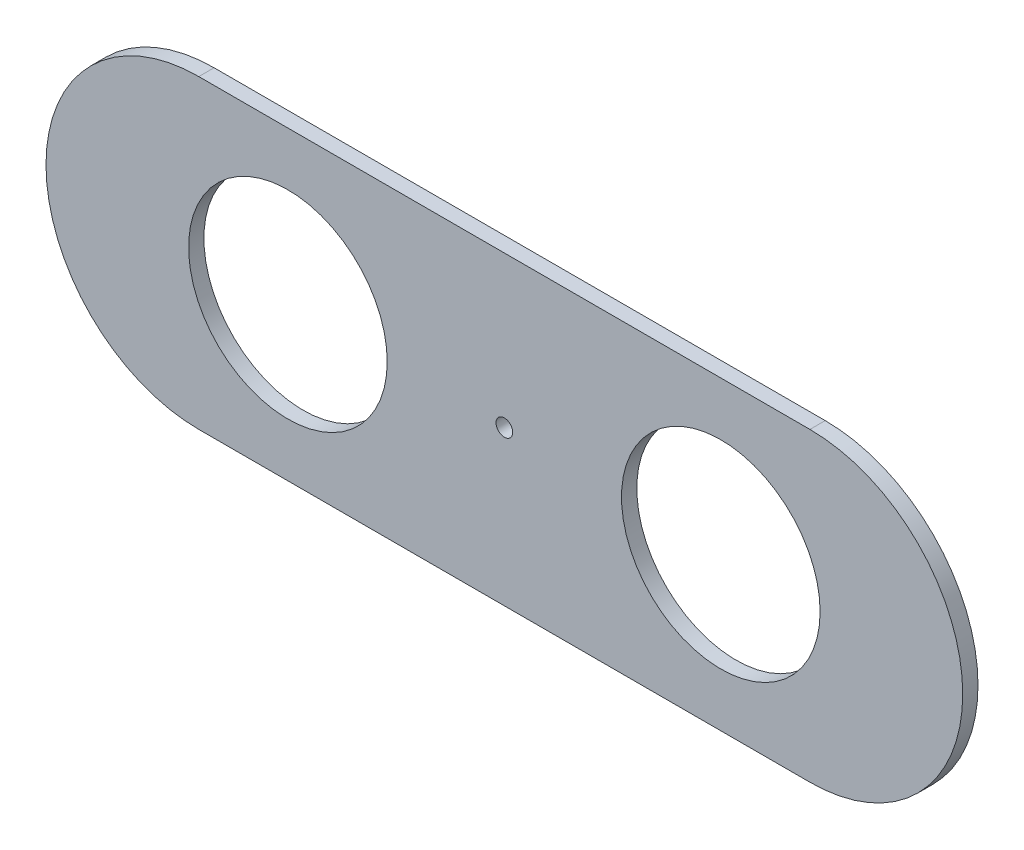
ISO-10303-21;
HEADER;
FILE_DESCRIPTION(('STEP AP214'),'2;1');
FILE_NAME('part.step','',(''),(''),'','','');
FILE_SCHEMA(('AUTOMOTIVE_DESIGN { 1 0 10303 214 1 1 1 1 }'));
ENDSEC;
DATA;
#1=APPLICATION_CONTEXT('core data for automotive mechanical design processes');
#2=APPLICATION_PROTOCOL_DEFINITION('international standard','automotive_design',2000,#1);
#3=PRODUCT_CONTEXT('',#1,'mechanical');
#4=PRODUCT('Part','Part','',(#3));
#5=PRODUCT_RELATED_PRODUCT_CATEGORY('part','',(#4));
#6=PRODUCT_DEFINITION_FORMATION('','',#4);
#7=PRODUCT_DEFINITION_CONTEXT('part definition',#1,'design');
#8=PRODUCT_DEFINITION('design','',#6,#7);
#9=PRODUCT_DEFINITION_SHAPE('','',#8);
#10=(LENGTH_UNIT() NAMED_UNIT(*) SI_UNIT(.MILLI.,.METRE.));
#11=(NAMED_UNIT(*) PLANE_ANGLE_UNIT() SI_UNIT($,.RADIAN.));
#12=(NAMED_UNIT(*) SI_UNIT($,.STERADIAN.) SOLID_ANGLE_UNIT());
#13=UNCERTAINTY_MEASURE_WITH_UNIT(LENGTH_MEASURE(1.E-05),#10,'distance_accuracy_value','');
#14=(GEOMETRIC_REPRESENTATION_CONTEXT(3) GLOBAL_UNCERTAINTY_ASSIGNED_CONTEXT((#13)) GLOBAL_UNIT_ASSIGNED_CONTEXT((#10,
#11,#12)) REPRESENTATION_CONTEXT('',''));
#15=CARTESIAN_POINT('',(0.,0.,0.));
#16=DIRECTION('',(0.,0.,1.));
#17=DIRECTION('',(1.,0.,0.));
#18=AXIS2_PLACEMENT_3D('',#15,#16,#17);
#19=CARTESIAN_POINT('',(120.,0.,6.));
#20=DIRECTION('',(0.,0.,-1.));
#21=DIRECTION('',(-1.,0.,0.));
#22=AXIS2_PLACEMENT_3D('',#19,#20,#21);
#23=CYLINDRICAL_SURFACE('',#22,60.);
#24=CARTESIAN_POINT('',(120.,0.,0.));
#25=DIRECTION('',(0.,0.,1.));
#26=DIRECTION('',(1.,0.,0.));
#27=AXIS2_PLACEMENT_3D('',#24,#25,#26);
#28=CIRCLE('',#27,60.);
#29=CARTESIAN_POINT('',(120.,-60.,0.));
#30=VERTEX_POINT('',#29);
#31=CARTESIAN_POINT('',(120.,60.,0.));
#32=VERTEX_POINT('',#31);
#33=EDGE_CURVE('E102',#30,#32,#28,.T.);
#34=ORIENTED_EDGE('',*,*,#33,.T.);
#35=DIRECTION('',(0.,0.,-1.));
#36=VECTOR('',#35,1.);
#37=CARTESIAN_POINT('',(120.,60.,6.));
#38=LINE('',#37,#36);
#39=CARTESIAN_POINT('',(120.,60.,6.));
#40=VERTEX_POINT('',#39);
#41=EDGE_CURVE('E11',#40,#32,#38,.T.);
#42=ORIENTED_EDGE('',*,*,#41,.F.);
#43=CARTESIAN_POINT('',(120.,0.,6.));
#44=DIRECTION('',(0.,0.,1.));
#45=DIRECTION('',(1.,0.,0.));
#46=AXIS2_PLACEMENT_3D('',#43,#44,#45);
#47=CIRCLE('',#46,60.);
#48=CARTESIAN_POINT('',(120.,-60.,6.));
#49=VERTEX_POINT('',#48);
#50=EDGE_CURVE('E90',#49,#40,#47,.T.);
#51=ORIENTED_EDGE('',*,*,#50,.F.);
#52=DIRECTION('',(0.,0.,-1.));
#53=VECTOR('',#52,1.);
#54=CARTESIAN_POINT('',(120.,-60.,6.));
#55=LINE('',#54,#53);
#56=EDGE_CURVE('E98',#49,#30,#55,.T.);
#57=ORIENTED_EDGE('',*,*,#56,.T.);
#58=EDGE_LOOP('',(#34,#42,#51,#57));
#59=FACE_BOUND('',#58,.T.);
#60=ADVANCED_FACE('F39',(#59),#23,.T.);
#61=CARTESIAN_POINT('',(120.,60.,6.));
#62=DIRECTION('',(0.,-1.,0.));
#63=DIRECTION('',(1.,0.,0.));
#64=AXIS2_PLACEMENT_3D('',#61,#62,#63);
#65=PLANE('',#64);
#66=DIRECTION('',(-1.,0.,0.));
#67=VECTOR('',#66,1.);
#68=CARTESIAN_POINT('',(120.,60.,0.));
#69=LINE('',#68,#67);
#70=CARTESIAN_POINT('',(-120.,60.,0.));
#71=VERTEX_POINT('',#70);
#72=EDGE_CURVE('E94',#32,#71,#69,.T.);
#73=ORIENTED_EDGE('',*,*,#72,.T.);
#74=DIRECTION('',(0.,0.,-1.));
#75=VECTOR('',#74,1.);
#76=CARTESIAN_POINT('',(-120.,60.,6.));
#77=LINE('',#76,#75);
#78=CARTESIAN_POINT('',(-120.,60.,6.));
#79=VERTEX_POINT('',#78);
#80=EDGE_CURVE('E47',#79,#71,#77,.T.);
#81=ORIENTED_EDGE('',*,*,#80,.F.);
#82=DIRECTION('',(-1.,0.,0.));
#83=VECTOR('',#82,1.);
#84=CARTESIAN_POINT('',(120.,60.,6.));
#85=LINE('',#84,#83);
#86=EDGE_CURVE('E85',#40,#79,#85,.T.);
#87=ORIENTED_EDGE('',*,*,#86,.F.);
#88=ORIENTED_EDGE('',*,*,#41,.T.);
#89=EDGE_LOOP('',(#73,#81,#87,#88));
#90=FACE_BOUND('',#89,.T.);
#91=ADVANCED_FACE('F93',(#90),#65,.F.);
#92=CARTESIAN_POINT('',(-120.,0.,6.));
#93=DIRECTION('',(0.,0.,-1.));
#94=DIRECTION('',(-1.,0.,0.));
#95=AXIS2_PLACEMENT_3D('',#92,#93,#94);
#96=CYLINDRICAL_SURFACE('',#95,60.);
#97=CARTESIAN_POINT('',(-120.,0.,0.));
#98=DIRECTION('',(0.,0.,1.));
#99=DIRECTION('',(1.,0.,0.));
#100=AXIS2_PLACEMENT_3D('',#97,#98,#99);
#101=CIRCLE('',#100,60.);
#102=CARTESIAN_POINT('',(-120.,-60.,0.));
#103=VERTEX_POINT('',#102);
#104=EDGE_CURVE('E72',#71,#103,#101,.T.);
#105=ORIENTED_EDGE('',*,*,#104,.T.);
#106=DIRECTION('',(0.,0.,-1.));
#107=VECTOR('',#106,1.);
#108=CARTESIAN_POINT('',(-120.,-60.,6.));
#109=LINE('',#108,#107);
#110=CARTESIAN_POINT('',(-120.,-60.,6.));
#111=VERTEX_POINT('',#110);
#112=EDGE_CURVE('E95',#111,#103,#109,.T.);
#113=ORIENTED_EDGE('',*,*,#112,.F.);
#114=CARTESIAN_POINT('',(-120.,0.,6.));
#115=DIRECTION('',(0.,0.,1.));
#116=DIRECTION('',(1.,0.,0.));
#117=AXIS2_PLACEMENT_3D('',#114,#115,#116);
#118=CIRCLE('',#117,60.);
#119=EDGE_CURVE('E88',#79,#111,#118,.T.);
#120=ORIENTED_EDGE('',*,*,#119,.F.);
#121=ORIENTED_EDGE('',*,*,#80,.T.);
#122=EDGE_LOOP('',(#105,#113,#120,#121));
#123=FACE_BOUND('',#122,.T.);
#124=ADVANCED_FACE('F96',(#123),#96,.T.);
#125=CARTESIAN_POINT('',(120.,-60.,6.));
#126=DIRECTION('',(0.,1.,0.));
#127=DIRECTION('',(-1.,0.,0.));
#128=AXIS2_PLACEMENT_3D('',#125,#126,#127);
#129=PLANE('',#128);
#130=DIRECTION('',(1.,0.,0.));
#131=VECTOR('',#130,1.);
#132=CARTESIAN_POINT('',(120.,-60.,0.));
#133=LINE('',#132,#131);
#134=EDGE_CURVE('E78',#103,#30,#133,.T.);
#135=ORIENTED_EDGE('',*,*,#134,.T.);
#136=ORIENTED_EDGE('',*,*,#56,.F.);
#137=DIRECTION('',(1.,0.,0.));
#138=VECTOR('',#137,1.);
#139=CARTESIAN_POINT('',(120.,-60.,6.));
#140=LINE('',#139,#138);
#141=EDGE_CURVE('E55',#111,#49,#140,.T.);
#142=ORIENTED_EDGE('',*,*,#141,.F.);
#143=ORIENTED_EDGE('',*,*,#112,.T.);
#144=EDGE_LOOP('',(#135,#136,#142,#143));
#145=FACE_BOUND('',#144,.T.);
#146=ADVANCED_FACE('F110',(#145),#129,.F.);
#147=CARTESIAN_POINT('',(120.,0.,6.));
#148=DIRECTION('',(0.,0.,1.));
#149=DIRECTION('',(1.,0.,0.));
#150=AXIS2_PLACEMENT_3D('',#147,#148,#149);
#151=PLANE('',#150);
#152=CARTESIAN_POINT('',(-85.,0.,6.));
#153=DIRECTION('',(0.,0.,1.));
#154=DIRECTION('',(1.,0.,0.));
#155=AXIS2_PLACEMENT_3D('',#152,#153,#154);
#156=CIRCLE('',#155,39.);
#157=CARTESIAN_POINT('',(-46.,0.,6.));
#158=VERTEX_POINT('',#157);
#159=EDGE_CURVE('E125',#158,#158,#156,.T.);
#160=ORIENTED_EDGE('',*,*,#159,.F.);
#161=EDGE_LOOP('',(#160));
#162=FACE_BOUND('',#161,.T.);
#163=CARTESIAN_POINT('',(85.,0.,6.));
#164=DIRECTION('',(0.,0.,1.));
#165=DIRECTION('',(1.,0.,0.));
#166=AXIS2_PLACEMENT_3D('',#163,#164,#165);
#167=CIRCLE('',#166,39.);
#168=CARTESIAN_POINT('',(124.,0.,6.));
#169=VERTEX_POINT('',#168);
#170=EDGE_CURVE('E122',#169,#169,#167,.T.);
#171=ORIENTED_EDGE('',*,*,#170,.F.);
#172=EDGE_LOOP('',(#171));
#173=FACE_BOUND('',#172,.T.);
#174=CARTESIAN_POINT('',(0.,0.625000000000046,6.));
#175=DIRECTION('',(0.,0.,1.));
#176=DIRECTION('',(1.,0.,0.));
#177=AXIS2_PLACEMENT_3D('',#174,#175,#176);
#178=CIRCLE('',#177,3.275);
#179=CARTESIAN_POINT('',(3.275,0.625000000000046,6.));
#180=VERTEX_POINT('',#179);
#181=EDGE_CURVE('E118',#180,#180,#178,.T.);
#182=ORIENTED_EDGE('',*,*,#181,.F.);
#183=EDGE_LOOP('',(#182));
#184=FACE_BOUND('',#183,.T.);
#185=ORIENTED_EDGE('',*,*,#50,.T.);
#186=ORIENTED_EDGE('',*,*,#86,.T.);
#187=ORIENTED_EDGE('',*,*,#119,.T.);
#188=ORIENTED_EDGE('',*,*,#141,.T.);
#189=EDGE_LOOP('',(#185,#186,#187,#188));
#190=FACE_BOUND('',#189,.T.);
#191=ADVANCED_FACE('F86',(#162,#173,#184,#190),#151,.T.);
#192=CARTESIAN_POINT('',(120.,0.,0.));
#193=DIRECTION('',(0.,0.,1.));
#194=DIRECTION('',(1.,0.,0.));
#195=AXIS2_PLACEMENT_3D('',#192,#193,#194);
#196=PLANE('',#195);
#197=CARTESIAN_POINT('',(-85.,0.,0.));
#198=DIRECTION('',(0.,0.,1.));
#199=DIRECTION('',(1.,0.,0.));
#200=AXIS2_PLACEMENT_3D('',#197,#198,#199);
#201=CIRCLE('',#200,39.);
#202=CARTESIAN_POINT('',(-46.,0.,0.));
#203=VERTEX_POINT('',#202);
#204=EDGE_CURVE('E121',#203,#203,#201,.F.);
#205=ORIENTED_EDGE('',*,*,#204,.F.);
#206=EDGE_LOOP('',(#205));
#207=FACE_BOUND('',#206,.T.);
#208=CARTESIAN_POINT('',(85.,0.,0.));
#209=DIRECTION('',(0.,0.,1.));
#210=DIRECTION('',(1.,0.,0.));
#211=AXIS2_PLACEMENT_3D('',#208,#209,#210);
#212=CIRCLE('',#211,39.);
#213=CARTESIAN_POINT('',(124.,0.,0.));
#214=VERTEX_POINT('',#213);
#215=EDGE_CURVE('E126',#214,#214,#212,.F.);
#216=ORIENTED_EDGE('',*,*,#215,.F.);
#217=EDGE_LOOP('',(#216));
#218=FACE_BOUND('',#217,.T.);
#219=CARTESIAN_POINT('',(0.,0.625000000000046,0.));
#220=DIRECTION('',(0.,0.,1.));
#221=DIRECTION('',(1.,0.,0.));
#222=AXIS2_PLACEMENT_3D('',#219,#220,#221);
#223=CIRCLE('',#222,3.275);
#224=CARTESIAN_POINT('',(3.275,0.625000000000046,0.));
#225=VERTEX_POINT('',#224);
#226=EDGE_CURVE('E105',#225,#225,#223,.F.);
#227=ORIENTED_EDGE('',*,*,#226,.F.);
#228=EDGE_LOOP('',(#227));
#229=FACE_BOUND('',#228,.T.);
#230=ORIENTED_EDGE('',*,*,#33,.F.);
#231=ORIENTED_EDGE('',*,*,#134,.F.);
#232=ORIENTED_EDGE('',*,*,#104,.F.);
#233=ORIENTED_EDGE('',*,*,#72,.F.);
#234=EDGE_LOOP('',(#230,#231,#232,#233));
#235=FACE_BOUND('',#234,.T.);
#236=ADVANCED_FACE('F113',(#207,#218,#229,#235),#196,.F.);
#237=CARTESIAN_POINT('',(0.,0.625000000000046,-0.00100000000000013));
#238=DIRECTION('',(0.,0.,1.));
#239=DIRECTION('',(1.,0.,0.));
#240=AXIS2_PLACEMENT_3D('',#237,#238,#239);
#241=CYLINDRICAL_SURFACE('',#240,3.275);
#242=CARTESIAN_POINT('',(3.275,0.625000000000046,6.));
#243=CARTESIAN_POINT('',(3.275,0.625000000000046,5.9375));
#244=CARTESIAN_POINT('',(3.275,0.625000000000046,5.875));
#245=CARTESIAN_POINT('',(3.275,0.625000000000046,5.75));
#246=CARTESIAN_POINT('',(3.275,0.625000000000046,5.6875));
#247=CARTESIAN_POINT('',(3.275,0.625000000000046,5.5625));
#248=CARTESIAN_POINT('',(3.275,0.625000000000046,5.5));
#249=CARTESIAN_POINT('',(3.275,0.625000000000046,5.375));
#250=CARTESIAN_POINT('',(3.275,0.625000000000046,5.3125));
#251=CARTESIAN_POINT('',(3.275,0.625000000000046,5.1875));
#252=CARTESIAN_POINT('',(3.275,0.625000000000046,5.125));
#253=CARTESIAN_POINT('',(3.275,0.625000000000046,5.));
#254=CARTESIAN_POINT('',(3.275,0.625000000000046,4.9375));
#255=CARTESIAN_POINT('',(3.275,0.625000000000046,4.8125));
#256=CARTESIAN_POINT('',(3.275,0.625000000000046,4.75));
#257=CARTESIAN_POINT('',(3.275,0.625000000000046,4.625));
#258=CARTESIAN_POINT('',(3.275,0.625000000000046,4.5625));
#259=CARTESIAN_POINT('',(3.275,0.625000000000046,4.4375));
#260=CARTESIAN_POINT('',(3.275,0.625000000000046,4.375));
#261=CARTESIAN_POINT('',(3.275,0.625000000000046,4.25));
#262=CARTESIAN_POINT('',(3.275,0.625000000000046,4.1875));
#263=CARTESIAN_POINT('',(3.275,0.625000000000046,4.0625));
#264=CARTESIAN_POINT('',(3.275,0.625000000000046,4.));
#265=CARTESIAN_POINT('',(3.275,0.625000000000046,3.875));
#266=CARTESIAN_POINT('',(3.275,0.625000000000046,3.8125));
#267=CARTESIAN_POINT('',(3.275,0.625000000000046,3.6875));
#268=CARTESIAN_POINT('',(3.275,0.625000000000046,3.625));
#269=CARTESIAN_POINT('',(3.275,0.625000000000046,3.5));
#270=CARTESIAN_POINT('',(3.275,0.625000000000046,3.4375));
#271=CARTESIAN_POINT('',(3.275,0.625000000000046,3.3125));
#272=CARTESIAN_POINT('',(3.275,0.625000000000046,3.25));
#273=CARTESIAN_POINT('',(3.275,0.625000000000046,3.125));
#274=CARTESIAN_POINT('',(3.275,0.625000000000046,3.0625));
#275=CARTESIAN_POINT('',(3.275,0.625000000000046,2.9375));
#276=CARTESIAN_POINT('',(3.275,0.625000000000046,2.875));
#277=CARTESIAN_POINT('',(3.275,0.625000000000046,2.75));
#278=CARTESIAN_POINT('',(3.275,0.625000000000046,2.6875));
#279=CARTESIAN_POINT('',(3.275,0.625000000000046,2.5625));
#280=CARTESIAN_POINT('',(3.275,0.625000000000046,2.5));
#281=CARTESIAN_POINT('',(3.275,0.625000000000046,2.375));
#282=CARTESIAN_POINT('',(3.275,0.625000000000046,2.3125));
#283=CARTESIAN_POINT('',(3.275,0.625000000000046,2.1875));
#284=CARTESIAN_POINT('',(3.275,0.625000000000046,2.125));
#285=CARTESIAN_POINT('',(3.275,0.625000000000046,2.));
#286=CARTESIAN_POINT('',(3.275,0.625000000000046,1.9375));
#287=CARTESIAN_POINT('',(3.275,0.625000000000046,1.8125));
#288=CARTESIAN_POINT('',(3.275,0.625000000000046,1.75));
#289=CARTESIAN_POINT('',(3.275,0.625000000000046,1.625));
#290=CARTESIAN_POINT('',(3.275,0.625000000000046,1.5625));
#291=CARTESIAN_POINT('',(3.275,0.625000000000046,1.4375));
#292=CARTESIAN_POINT('',(3.275,0.625000000000046,1.375));
#293=CARTESIAN_POINT('',(3.275,0.625000000000046,1.25));
#294=CARTESIAN_POINT('',(3.275,0.625000000000046,1.1875));
#295=CARTESIAN_POINT('',(3.275,0.625000000000046,1.0625));
#296=CARTESIAN_POINT('',(3.275,0.625000000000046,1.));
#297=CARTESIAN_POINT('',(3.275,0.625000000000046,0.875));
#298=CARTESIAN_POINT('',(3.275,0.625000000000046,0.8125));
#299=CARTESIAN_POINT('',(3.275,0.625000000000046,0.6875));
#300=CARTESIAN_POINT('',(3.275,0.625000000000046,0.625));
#301=CARTESIAN_POINT('',(3.275,0.625000000000046,0.5));
#302=CARTESIAN_POINT('',(3.275,0.625000000000046,0.4375));
#303=CARTESIAN_POINT('',(3.275,0.625000000000046,0.3125));
#304=CARTESIAN_POINT('',(3.275,0.625000000000046,0.25));
#305=CARTESIAN_POINT('',(3.275,0.625000000000046,0.125));
#306=CARTESIAN_POINT('',(3.275,0.625000000000046,0.0625000000000001));
#307=CARTESIAN_POINT('',(3.275,0.625000000000046,0.));
#308=B_SPLINE_CURVE_WITH_KNOTS('',3,(#242,#243,#244,#245,#246,#247,#248,#249,#250,#251,#252,
#253,#254,#255,#256,#257,#258,#259,#260,#261,#262,#263,#264,#265,#266,#267,#268,#269,#270,#271,
#272,#273,#274,#275,#276,#277,#278,#279,#280,#281,#282,#283,#284,#285,#286,#287,#288,#289,#290,
#291,#292,#293,#294,#295,#296,#297,#298,#299,#300,#301,#302,#303,#304,#305,#306,#307),
.UNSPECIFIED.,.F.,.F.,(4,2,2,2,2,2,2,2,2,2,2,2,2,2,2,2,2,2,2,2,2,2,2,2,2,2,2,2,2,2,2,2,4),(0.,
0.1875,0.375,0.5625,0.75,0.9375,1.125,1.3125,1.5,1.6875,1.875,2.0625,2.25,2.4375,2.625,2.8125,
3.,3.1875,3.375,3.5625,3.75,3.9375,4.125,4.3125,4.5,4.6875,4.875,5.0625,5.25,5.4375,5.625,
5.8125,6.),.UNSPECIFIED.);
#309=EDGE_CURVE('BSEAM144',#180,#225,#308,.T.);
#310=ORIENTED_EDGE('',*,*,#181,.T.);
#311=ORIENTED_EDGE('',*,*,#226,.T.);
#312=ORIENTED_EDGE('',*,*,#309,.T.);
#313=ORIENTED_EDGE('',*,*,#309,.F.);
#314=EDGE_LOOP('',(#310,#312,#311,#313));
#315=FACE_BOUND('',#314,.T.);
#316=ADVANCED_FACE('F144',(#315),#241,.F.);
#317=CARTESIAN_POINT('',(85.,0.,-0.00100000000000013));
#318=DIRECTION('',(0.,0.,1.));
#319=DIRECTION('',(1.,0.,0.));
#320=AXIS2_PLACEMENT_3D('',#317,#318,#319);
#321=CYLINDRICAL_SURFACE('',#320,39.);
#322=CARTESIAN_POINT('',(124.,0.,6.));
#323=CARTESIAN_POINT('',(124.,0.,5.9375));
#324=CARTESIAN_POINT('',(124.,0.,5.875));
#325=CARTESIAN_POINT('',(124.,0.,5.75));
#326=CARTESIAN_POINT('',(124.,0.,5.6875));
#327=CARTESIAN_POINT('',(124.,0.,5.5625));
#328=CARTESIAN_POINT('',(124.,0.,5.5));
#329=CARTESIAN_POINT('',(124.,0.,5.375));
#330=CARTESIAN_POINT('',(124.,0.,5.3125));
#331=CARTESIAN_POINT('',(124.,0.,5.1875));
#332=CARTESIAN_POINT('',(124.,0.,5.125));
#333=CARTESIAN_POINT('',(124.,0.,5.));
#334=CARTESIAN_POINT('',(124.,0.,4.9375));
#335=CARTESIAN_POINT('',(124.,0.,4.8125));
#336=CARTESIAN_POINT('',(124.,0.,4.75));
#337=CARTESIAN_POINT('',(124.,0.,4.625));
#338=CARTESIAN_POINT('',(124.,0.,4.5625));
#339=CARTESIAN_POINT('',(124.,0.,4.4375));
#340=CARTESIAN_POINT('',(124.,0.,4.375));
#341=CARTESIAN_POINT('',(124.,0.,4.25));
#342=CARTESIAN_POINT('',(124.,0.,4.1875));
#343=CARTESIAN_POINT('',(124.,0.,4.0625));
#344=CARTESIAN_POINT('',(124.,0.,4.));
#345=CARTESIAN_POINT('',(124.,0.,3.875));
#346=CARTESIAN_POINT('',(124.,0.,3.8125));
#347=CARTESIAN_POINT('',(124.,0.,3.6875));
#348=CARTESIAN_POINT('',(124.,0.,3.625));
#349=CARTESIAN_POINT('',(124.,0.,3.5));
#350=CARTESIAN_POINT('',(124.,0.,3.4375));
#351=CARTESIAN_POINT('',(124.,0.,3.3125));
#352=CARTESIAN_POINT('',(124.,0.,3.25));
#353=CARTESIAN_POINT('',(124.,0.,3.125));
#354=CARTESIAN_POINT('',(124.,0.,3.0625));
#355=CARTESIAN_POINT('',(124.,0.,2.9375));
#356=CARTESIAN_POINT('',(124.,0.,2.875));
#357=CARTESIAN_POINT('',(124.,0.,2.75));
#358=CARTESIAN_POINT('',(124.,0.,2.6875));
#359=CARTESIAN_POINT('',(124.,0.,2.5625));
#360=CARTESIAN_POINT('',(124.,0.,2.5));
#361=CARTESIAN_POINT('',(124.,0.,2.375));
#362=CARTESIAN_POINT('',(124.,0.,2.3125));
#363=CARTESIAN_POINT('',(124.,0.,2.1875));
#364=CARTESIAN_POINT('',(124.,0.,2.125));
#365=CARTESIAN_POINT('',(124.,0.,2.));
#366=CARTESIAN_POINT('',(124.,0.,1.9375));
#367=CARTESIAN_POINT('',(124.,0.,1.8125));
#368=CARTESIAN_POINT('',(124.,0.,1.75));
#369=CARTESIAN_POINT('',(124.,0.,1.625));
#370=CARTESIAN_POINT('',(124.,0.,1.5625));
#371=CARTESIAN_POINT('',(124.,0.,1.4375));
#372=CARTESIAN_POINT('',(124.,0.,1.375));
#373=CARTESIAN_POINT('',(124.,0.,1.25));
#374=CARTESIAN_POINT('',(124.,0.,1.1875));
#375=CARTESIAN_POINT('',(124.,0.,1.0625));
#376=CARTESIAN_POINT('',(124.,0.,1.));
#377=CARTESIAN_POINT('',(124.,0.,0.875));
#378=CARTESIAN_POINT('',(124.,0.,0.8125));
#379=CARTESIAN_POINT('',(124.,0.,0.6875));
#380=CARTESIAN_POINT('',(124.,0.,0.625));
#381=CARTESIAN_POINT('',(124.,0.,0.5));
#382=CARTESIAN_POINT('',(124.,0.,0.4375));
#383=CARTESIAN_POINT('',(124.,0.,0.3125));
#384=CARTESIAN_POINT('',(124.,0.,0.25));
#385=CARTESIAN_POINT('',(124.,0.,0.125));
#386=CARTESIAN_POINT('',(124.,0.,0.0625000000000001));
#387=CARTESIAN_POINT('',(124.,0.,0.));
#388=B_SPLINE_CURVE_WITH_KNOTS('',3,(#322,#323,#324,#325,#326,#327,#328,#329,#330,#331,#332,
#333,#334,#335,#336,#337,#338,#339,#340,#341,#342,#343,#344,#345,#346,#347,#348,#349,#350,#351,
#352,#353,#354,#355,#356,#357,#358,#359,#360,#361,#362,#363,#364,#365,#366,#367,#368,#369,#370,
#371,#372,#373,#374,#375,#376,#377,#378,#379,#380,#381,#382,#383,#384,#385,#386,#387),
.UNSPECIFIED.,.F.,.F.,(4,2,2,2,2,2,2,2,2,2,2,2,2,2,2,2,2,2,2,2,2,2,2,2,2,2,2,2,2,2,2,2,4),(0.,
0.1875,0.375,0.5625,0.75,0.9375,1.125,1.3125,1.5,1.6875,1.875,2.0625,2.25,2.4375,2.625,2.8125,
3.,3.1875,3.375,3.5625,3.75,3.9375,4.125,4.3125,4.5,4.6875,4.875,5.0625,5.25,5.4375,5.625,
5.8125,6.),.UNSPECIFIED.);
#389=EDGE_CURVE('BSEAM147',#169,#214,#388,.T.);
#390=ORIENTED_EDGE('',*,*,#170,.T.);
#391=ORIENTED_EDGE('',*,*,#215,.T.);
#392=ORIENTED_EDGE('',*,*,#389,.T.);
#393=ORIENTED_EDGE('',*,*,#389,.F.);
#394=EDGE_LOOP('',(#390,#392,#391,#393));
#395=FACE_BOUND('',#394,.T.);
#396=ADVANCED_FACE('F147',(#395),#321,.F.);
#397=CARTESIAN_POINT('',(-85.,0.,-0.00100000000000013));
#398=DIRECTION('',(0.,0.,1.));
#399=DIRECTION('',(1.,0.,0.));
#400=AXIS2_PLACEMENT_3D('',#397,#398,#399);
#401=CYLINDRICAL_SURFACE('',#400,39.);
#402=CARTESIAN_POINT('',(-46.,0.,6.));
#403=CARTESIAN_POINT('',(-46.,0.,5.9375));
#404=CARTESIAN_POINT('',(-46.,0.,5.875));
#405=CARTESIAN_POINT('',(-46.,0.,5.75));
#406=CARTESIAN_POINT('',(-46.,0.,5.6875));
#407=CARTESIAN_POINT('',(-46.,0.,5.5625));
#408=CARTESIAN_POINT('',(-46.,0.,5.5));
#409=CARTESIAN_POINT('',(-46.,0.,5.375));
#410=CARTESIAN_POINT('',(-46.,0.,5.3125));
#411=CARTESIAN_POINT('',(-46.,0.,5.1875));
#412=CARTESIAN_POINT('',(-46.,0.,5.125));
#413=CARTESIAN_POINT('',(-46.,0.,5.));
#414=CARTESIAN_POINT('',(-46.,0.,4.9375));
#415=CARTESIAN_POINT('',(-46.,0.,4.8125));
#416=CARTESIAN_POINT('',(-46.,0.,4.75));
#417=CARTESIAN_POINT('',(-46.,0.,4.625));
#418=CARTESIAN_POINT('',(-46.,0.,4.5625));
#419=CARTESIAN_POINT('',(-46.,0.,4.4375));
#420=CARTESIAN_POINT('',(-46.,0.,4.375));
#421=CARTESIAN_POINT('',(-46.,0.,4.25));
#422=CARTESIAN_POINT('',(-46.,0.,4.1875));
#423=CARTESIAN_POINT('',(-46.,0.,4.0625));
#424=CARTESIAN_POINT('',(-46.,0.,4.));
#425=CARTESIAN_POINT('',(-46.,0.,3.875));
#426=CARTESIAN_POINT('',(-46.,0.,3.8125));
#427=CARTESIAN_POINT('',(-46.,0.,3.6875));
#428=CARTESIAN_POINT('',(-46.,0.,3.625));
#429=CARTESIAN_POINT('',(-46.,0.,3.5));
#430=CARTESIAN_POINT('',(-46.,0.,3.4375));
#431=CARTESIAN_POINT('',(-46.,0.,3.3125));
#432=CARTESIAN_POINT('',(-46.,0.,3.25));
#433=CARTESIAN_POINT('',(-46.,0.,3.125));
#434=CARTESIAN_POINT('',(-46.,0.,3.0625));
#435=CARTESIAN_POINT('',(-46.,0.,2.9375));
#436=CARTESIAN_POINT('',(-46.,0.,2.875));
#437=CARTESIAN_POINT('',(-46.,0.,2.75));
#438=CARTESIAN_POINT('',(-46.,0.,2.6875));
#439=CARTESIAN_POINT('',(-46.,0.,2.5625));
#440=CARTESIAN_POINT('',(-46.,0.,2.5));
#441=CARTESIAN_POINT('',(-46.,0.,2.375));
#442=CARTESIAN_POINT('',(-46.,0.,2.3125));
#443=CARTESIAN_POINT('',(-46.,0.,2.1875));
#444=CARTESIAN_POINT('',(-46.,0.,2.125));
#445=CARTESIAN_POINT('',(-46.,0.,2.));
#446=CARTESIAN_POINT('',(-46.,0.,1.9375));
#447=CARTESIAN_POINT('',(-46.,0.,1.8125));
#448=CARTESIAN_POINT('',(-46.,0.,1.75));
#449=CARTESIAN_POINT('',(-46.,0.,1.625));
#450=CARTESIAN_POINT('',(-46.,0.,1.5625));
#451=CARTESIAN_POINT('',(-46.,0.,1.4375));
#452=CARTESIAN_POINT('',(-46.,0.,1.375));
#453=CARTESIAN_POINT('',(-46.,0.,1.25));
#454=CARTESIAN_POINT('',(-46.,0.,1.1875));
#455=CARTESIAN_POINT('',(-46.,0.,1.0625));
#456=CARTESIAN_POINT('',(-46.,0.,1.));
#457=CARTESIAN_POINT('',(-46.,0.,0.875));
#458=CARTESIAN_POINT('',(-46.,0.,0.8125));
#459=CARTESIAN_POINT('',(-46.,0.,0.6875));
#460=CARTESIAN_POINT('',(-46.,0.,0.625));
#461=CARTESIAN_POINT('',(-46.,0.,0.5));
#462=CARTESIAN_POINT('',(-46.,0.,0.4375));
#463=CARTESIAN_POINT('',(-46.,0.,0.3125));
#464=CARTESIAN_POINT('',(-46.,0.,0.25));
#465=CARTESIAN_POINT('',(-46.,0.,0.125));
#466=CARTESIAN_POINT('',(-46.,0.,0.0625000000000001));
#467=CARTESIAN_POINT('',(-46.,0.,0.));
#468=B_SPLINE_CURVE_WITH_KNOTS('',3,(#402,#403,#404,#405,#406,#407,#408,#409,#410,#411,#412,
#413,#414,#415,#416,#417,#418,#419,#420,#421,#422,#423,#424,#425,#426,#427,#428,#429,#430,#431,
#432,#433,#434,#435,#436,#437,#438,#439,#440,#441,#442,#443,#444,#445,#446,#447,#448,#449,#450,
#451,#452,#453,#454,#455,#456,#457,#458,#459,#460,#461,#462,#463,#464,#465,#466,#467),
.UNSPECIFIED.,.F.,.F.,(4,2,2,2,2,2,2,2,2,2,2,2,2,2,2,2,2,2,2,2,2,2,2,2,2,2,2,2,2,2,2,2,4),(0.,
0.1875,0.375,0.5625,0.75,0.9375,1.125,1.3125,1.5,1.6875,1.875,2.0625,2.25,2.4375,2.625,2.8125,
3.,3.1875,3.375,3.5625,3.75,3.9375,4.125,4.3125,4.5,4.6875,4.875,5.0625,5.25,5.4375,5.625,
5.8125,6.),.UNSPECIFIED.);
#469=EDGE_CURVE('BSEAM134',#158,#203,#468,.T.);
#470=ORIENTED_EDGE('',*,*,#159,.T.);
#471=ORIENTED_EDGE('',*,*,#204,.T.);
#472=ORIENTED_EDGE('',*,*,#469,.T.);
#473=ORIENTED_EDGE('',*,*,#469,.F.);
#474=EDGE_LOOP('',(#470,#472,#471,#473));
#475=FACE_BOUND('',#474,.T.);
#476=ADVANCED_FACE('F134',(#475),#401,.F.);
#477=CLOSED_SHELL('',(#60,#91,#124,#146,#191,#236,#316,#396,#476));
#478=MANIFOLD_SOLID_BREP('B2',#477);
#479=ADVANCED_BREP_SHAPE_REPRESENTATION('',(#18,#478),#14);
#480=SHAPE_DEFINITION_REPRESENTATION(#9,#479);
ENDSEC;
END-ISO-10303-21;
